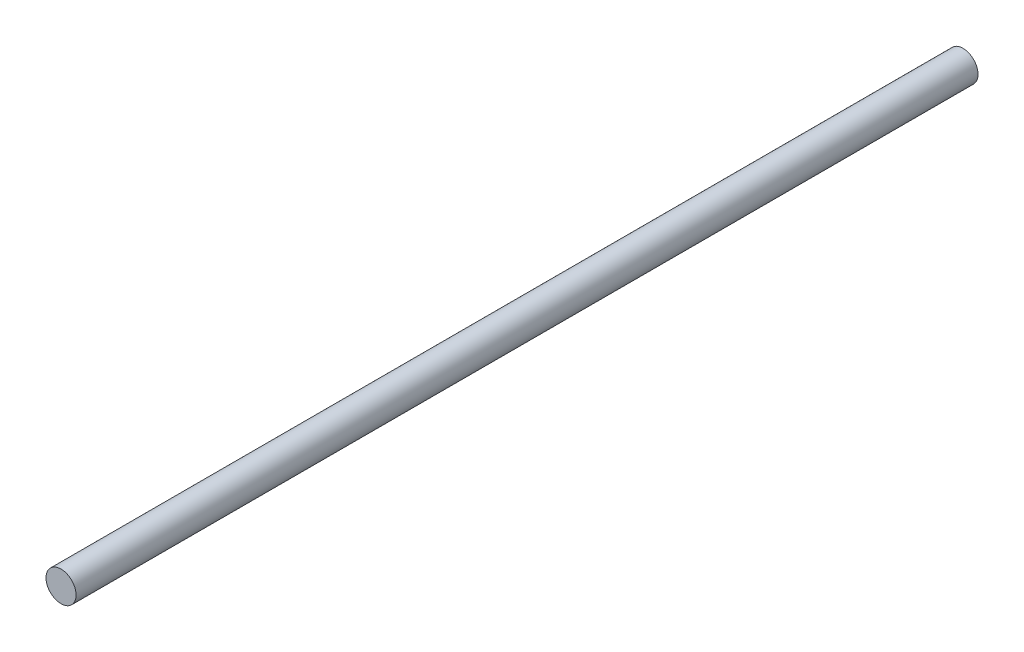
ISO-10303-21;
HEADER;
FILE_DESCRIPTION(('STEP AP214'),'2;1');
FILE_NAME('part.step','',(''),(''),'','','');
FILE_SCHEMA(('AUTOMOTIVE_DESIGN { 1 0 10303 214 1 1 1 1 }'));
ENDSEC;
DATA;
#1=APPLICATION_CONTEXT('core data for automotive mechanical design processes');
#2=APPLICATION_PROTOCOL_DEFINITION('international standard','automotive_design',2000,#1);
#3=PRODUCT_CONTEXT('',#1,'mechanical');
#4=PRODUCT('Part','Part','',(#3));
#5=PRODUCT_RELATED_PRODUCT_CATEGORY('part','',(#4));
#6=PRODUCT_DEFINITION_FORMATION('','',#4);
#7=PRODUCT_DEFINITION_CONTEXT('part definition',#1,'design');
#8=PRODUCT_DEFINITION('design','',#6,#7);
#9=PRODUCT_DEFINITION_SHAPE('','',#8);
#10=(LENGTH_UNIT() NAMED_UNIT(*) SI_UNIT(.MILLI.,.METRE.));
#11=(NAMED_UNIT(*) PLANE_ANGLE_UNIT() SI_UNIT($,.RADIAN.));
#12=(NAMED_UNIT(*) SI_UNIT($,.STERADIAN.) SOLID_ANGLE_UNIT());
#13=UNCERTAINTY_MEASURE_WITH_UNIT(LENGTH_MEASURE(1.E-05),#10,'distance_accuracy_value','');
#14=(GEOMETRIC_REPRESENTATION_CONTEXT(3) GLOBAL_UNCERTAINTY_ASSIGNED_CONTEXT((#13)) GLOBAL_UNIT_ASSIGNED_CONTEXT((#10,
#11,#12)) REPRESENTATION_CONTEXT('',''));
#15=CARTESIAN_POINT('',(0.,0.,0.));
#16=DIRECTION('',(0.,0.,1.));
#17=DIRECTION('',(1.,0.,0.));
#18=AXIS2_PLACEMENT_3D('',#15,#16,#17);
#19=CARTESIAN_POINT('',(0.,0.,190.5));
#20=DIRECTION('',(0.,0.,-0.999999999999999));
#21=DIRECTION('',(-0.999999999999999,0.,0.));
#22=AXIS2_PLACEMENT_3D('',#19,#20,#21);
#23=CYLINDRICAL_SURFACE('',#22,3.175);
#24=CARTESIAN_POINT('',(0.,0.,190.5));
#25=DIRECTION('',(0.,0.,0.999999999999999));
#26=DIRECTION('',(0.999999999999999,0.,0.));
#27=AXIS2_PLACEMENT_3D('',#24,#25,#26);
#28=CIRCLE('',#27,3.175);
#29=CARTESIAN_POINT('',(-3.175,0.,190.5));
#30=VERTEX_POINT('',#29);
#31=EDGE_CURVE('E10',#30,#30,#28,.T.);
#32=CARTESIAN_POINT('',(0.,0.,0.));
#33=DIRECTION('',(0.,0.,0.999999999999999));
#34=DIRECTION('',(0.999999999999999,0.,0.));
#35=AXIS2_PLACEMENT_3D('',#32,#33,#34);
#36=CIRCLE('',#35,3.175);
#37=CARTESIAN_POINT('',(-3.175,0.,0.));
#38=VERTEX_POINT('',#37);
#39=EDGE_CURVE('E33',#38,#38,#36,.T.);
#40=CARTESIAN_POINT('',(-3.175,0.,190.5));
#41=CARTESIAN_POINT('',(-3.175,0.,188.515625));
#42=CARTESIAN_POINT('',(-3.175,0.,186.53125));
#43=CARTESIAN_POINT('',(-3.175,0.,182.5625));
#44=CARTESIAN_POINT('',(-3.175,0.,180.578125));
#45=CARTESIAN_POINT('',(-3.175,0.,176.609375));
#46=CARTESIAN_POINT('',(-3.175,0.,174.625));
#47=CARTESIAN_POINT('',(-3.175,0.,170.65625));
#48=CARTESIAN_POINT('',(-3.175,0.,168.671875));
#49=CARTESIAN_POINT('',(-3.175,0.,164.703125));
#50=CARTESIAN_POINT('',(-3.175,0.,162.71875));
#51=CARTESIAN_POINT('',(-3.175,0.,158.75));
#52=CARTESIAN_POINT('',(-3.175,0.,156.765625));
#53=CARTESIAN_POINT('',(-3.175,0.,152.796875));
#54=CARTESIAN_POINT('',(-3.175,0.,150.8125));
#55=CARTESIAN_POINT('',(-3.175,0.,146.84375));
#56=CARTESIAN_POINT('',(-3.175,0.,144.859375));
#57=CARTESIAN_POINT('',(-3.175,0.,140.890625));
#58=CARTESIAN_POINT('',(-3.175,0.,138.90625));
#59=CARTESIAN_POINT('',(-3.175,0.,134.9375));
#60=CARTESIAN_POINT('',(-3.175,0.,132.953125));
#61=CARTESIAN_POINT('',(-3.175,0.,128.984375));
#62=CARTESIAN_POINT('',(-3.175,0.,127.));
#63=CARTESIAN_POINT('',(-3.175,0.,123.03125));
#64=CARTESIAN_POINT('',(-3.175,0.,121.046875));
#65=CARTESIAN_POINT('',(-3.175,0.,117.078125));
#66=CARTESIAN_POINT('',(-3.175,0.,115.09375));
#67=CARTESIAN_POINT('',(-3.175,0.,111.125));
#68=CARTESIAN_POINT('',(-3.175,0.,109.140625));
#69=CARTESIAN_POINT('',(-3.175,0.,105.171875));
#70=CARTESIAN_POINT('',(-3.175,0.,103.1875));
#71=CARTESIAN_POINT('',(-3.175,0.,99.2187499999999));
#72=CARTESIAN_POINT('',(-3.175,0.,97.2343749999998));
#73=CARTESIAN_POINT('',(-3.175,0.,93.2656249999999));
#74=CARTESIAN_POINT('',(-3.175,0.,91.2812499999999));
#75=CARTESIAN_POINT('',(-3.175,0.,87.3124999999999));
#76=CARTESIAN_POINT('',(-3.175,0.,85.3281249999999));
#77=CARTESIAN_POINT('',(-3.175,0.,81.3593749999999));
#78=CARTESIAN_POINT('',(-3.175,0.,79.3749999999999));
#79=CARTESIAN_POINT('',(-3.175,0.,75.4062499999999));
#80=CARTESIAN_POINT('',(-3.175,0.,73.4218749999999));
#81=CARTESIAN_POINT('',(-3.175,0.,69.4531249999999));
#82=CARTESIAN_POINT('',(-3.175,0.,67.4687499999999));
#83=CARTESIAN_POINT('',(-3.175,0.,63.4999999999999));
#84=CARTESIAN_POINT('',(-3.175,0.,61.5156249999999));
#85=CARTESIAN_POINT('',(-3.175,0.,57.5468749999999));
#86=CARTESIAN_POINT('',(-3.175,0.,55.5624999999999));
#87=CARTESIAN_POINT('',(-3.175,0.,51.5937499999999));
#88=CARTESIAN_POINT('',(-3.175,0.,49.6093749999999));
#89=CARTESIAN_POINT('',(-3.175,0.,45.6406249999999));
#90=CARTESIAN_POINT('',(-3.175,0.,43.6562499999999));
#91=CARTESIAN_POINT('',(-3.175,0.,39.6874999999999));
#92=CARTESIAN_POINT('',(-3.175,0.,37.7031249999999));
#93=CARTESIAN_POINT('',(-3.175,0.,33.7343749999999));
#94=CARTESIAN_POINT('',(-3.175,0.,31.7499999999999));
#95=CARTESIAN_POINT('',(-3.175,0.,27.7812499999999));
#96=CARTESIAN_POINT('',(-3.175,0.,25.7968749999999));
#97=CARTESIAN_POINT('',(-3.175,0.,21.8281249999999));
#98=CARTESIAN_POINT('',(-3.175,0.,19.8437499999999));
#99=CARTESIAN_POINT('',(-3.175,0.,15.875));
#100=CARTESIAN_POINT('',(-3.175,0.,13.890625));
#101=CARTESIAN_POINT('',(-3.175,0.,9.92187499999998));
#102=CARTESIAN_POINT('',(-3.175,0.,7.93749999999998));
#103=CARTESIAN_POINT('',(-3.175,0.,3.96874999999997));
#104=CARTESIAN_POINT('',(-3.175,0.,1.98437499999997));
#105=CARTESIAN_POINT('',(-3.175,0.,0.));
#106=B_SPLINE_CURVE_WITH_KNOTS('',3,(#40,#41,#42,#43,#44,#45,#46,#47,#48,#49,#50,#51,#52,#53,
#54,#55,#56,#57,#58,#59,#60,#61,#62,#63,#64,#65,#66,#67,#68,#69,#70,#71,#72,#73,#74,#75,#76,#77,
#78,#79,#80,#81,#82,#83,#84,#85,#86,#87,#88,#89,#90,#91,#92,#93,#94,#95,#96,#97,#98,#99,#100,
#101,#102,#103,#104,#105),.UNSPECIFIED.,.F.,.F.,(4,2,2,2,2,2,2,2,2,2,2,2,2,2,2,2,2,2,2,2,2,2,2,
2,2,2,2,2,2,2,2,2,4),(0.,5.95312499999998,11.90625,17.859375,23.8125,29.7656249999999,
35.7187499999999,41.6718749999999,47.6249999999999,53.5781249999999,59.5312499999999,
65.4843749999999,71.4374999999999,77.3906249999999,83.3437499999999,89.2968749999998,
95.2499999999998,101.203125,107.15625,113.109375,119.0625,125.015625,130.96875,136.921875,
142.875,148.828125,154.78125,160.734375,166.6875,172.640625,178.59375,184.546875,190.5),.UNSPECIFIED.);
#107=EDGE_CURVE('BSEAM30',#30,#38,#106,.T.);
#108=ORIENTED_EDGE('',*,*,#31,.F.);
#109=ORIENTED_EDGE('',*,*,#39,.T.);
#110=ORIENTED_EDGE('',*,*,#107,.T.);
#111=ORIENTED_EDGE('',*,*,#107,.F.);
#112=EDGE_LOOP('',(#108,#110,#109,#111));
#113=FACE_BOUND('',#112,.T.);
#114=ADVANCED_FACE('F30',(#113),#23,.T.);
#115=CARTESIAN_POINT('',(0.,0.,190.5));
#116=DIRECTION('',(0.,0.,0.999999999999999));
#117=DIRECTION('',(0.999999999999999,0.,0.));
#118=AXIS2_PLACEMENT_3D('',#115,#116,#117);
#119=PLANE('',#118);
#120=ORIENTED_EDGE('',*,*,#31,.T.);
#121=EDGE_LOOP('',(#120));
#122=FACE_BOUND('',#121,.T.);
#123=ADVANCED_FACE('F45',(#122),#119,.T.);
#124=CARTESIAN_POINT('',(0.,0.,0.));
#125=DIRECTION('',(0.,0.,0.999999999999999));
#126=DIRECTION('',(0.999999999999999,0.,0.));
#127=AXIS2_PLACEMENT_3D('',#124,#125,#126);
#128=PLANE('',#127);
#129=ORIENTED_EDGE('',*,*,#39,.F.);
#130=EDGE_LOOP('',(#129));
#131=FACE_BOUND('',#130,.T.);
#132=ADVANCED_FACE('F43',(#131),#128,.F.);
#133=CLOSED_SHELL('',(#114,#123,#132));
#134=MANIFOLD_SOLID_BREP('B2',#133);
#135=ADVANCED_BREP_SHAPE_REPRESENTATION('',(#18,#134),#14);
#136=SHAPE_DEFINITION_REPRESENTATION(#9,#135);
ENDSEC;
END-ISO-10303-21;
